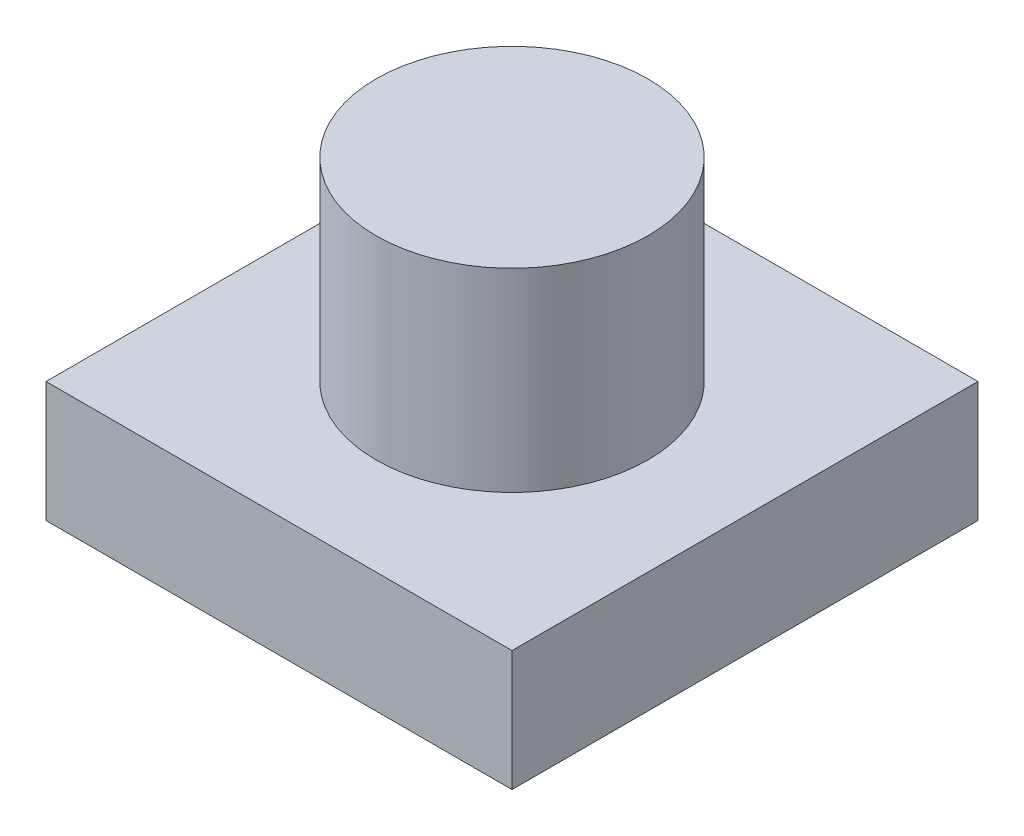
ISO-10303-21;
HEADER;
FILE_DESCRIPTION(('STEP AP214'),'2;1');
FILE_NAME('part.step','',(''),(''),'','','');
FILE_SCHEMA(('AUTOMOTIVE_DESIGN { 1 0 10303 214 1 1 1 1 }'));
ENDSEC;
DATA;
#1=APPLICATION_CONTEXT('core data for automotive mechanical design processes');
#2=APPLICATION_PROTOCOL_DEFINITION('international standard','automotive_design',2000,#1);
#3=PRODUCT_CONTEXT('',#1,'mechanical');
#4=PRODUCT('Part','Part','',(#3));
#5=PRODUCT_RELATED_PRODUCT_CATEGORY('part','',(#4));
#6=PRODUCT_DEFINITION_FORMATION('','',#4);
#7=PRODUCT_DEFINITION_CONTEXT('part definition',#1,'design');
#8=PRODUCT_DEFINITION('design','',#6,#7);
#9=PRODUCT_DEFINITION_SHAPE('','',#8);
#10=(LENGTH_UNIT() NAMED_UNIT(*) SI_UNIT(.MILLI.,.METRE.));
#11=(NAMED_UNIT(*) PLANE_ANGLE_UNIT() SI_UNIT($,.RADIAN.));
#12=(NAMED_UNIT(*) SI_UNIT($,.STERADIAN.) SOLID_ANGLE_UNIT());
#13=UNCERTAINTY_MEASURE_WITH_UNIT(LENGTH_MEASURE(1.E-05),#10,'distance_accuracy_value','');
#14=(GEOMETRIC_REPRESENTATION_CONTEXT(3) GLOBAL_UNCERTAINTY_ASSIGNED_CONTEXT((#13)) GLOBAL_UNIT_ASSIGNED_CONTEXT((#10,
#11,#12)) REPRESENTATION_CONTEXT('',''));
#15=CARTESIAN_POINT('',(0.,0.,0.));
#16=DIRECTION('',(0.,0.,1.));
#17=DIRECTION('',(1.,0.,0.));
#18=AXIS2_PLACEMENT_3D('',#15,#16,#17);
#19=CARTESIAN_POINT('',(-6.,3.1,-6.));
#20=DIRECTION('',(0.,1.,0.));
#21=DIRECTION('',(0.,0.,1.));
#22=AXIS2_PLACEMENT_3D('',#19,#20,#21);
#23=PLANE('',#22);
#24=DIRECTION('',(0.,0.,1.));
#25=VECTOR('',#24,1.);
#26=CARTESIAN_POINT('',(-6.,3.1,-6.));
#27=LINE('',#26,#25);
#28=CARTESIAN_POINT('',(-6.,3.1,-6.));
#29=VERTEX_POINT('',#28);
#30=CARTESIAN_POINT('',(-6.,3.1,6.));
#31=VERTEX_POINT('',#30);
#32=EDGE_CURVE('E101',#29,#31,#27,.T.);
#33=ORIENTED_EDGE('',*,*,#32,.T.);
#34=DIRECTION('',(1.,0.,0.));
#35=VECTOR('',#34,1.);
#36=CARTESIAN_POINT('',(-6.,3.1,6.));
#37=LINE('',#36,#35);
#38=CARTESIAN_POINT('',(6.00000000000003,3.1,6.));
#39=VERTEX_POINT('',#38);
#40=EDGE_CURVE('E86',#31,#39,#37,.T.);
#41=ORIENTED_EDGE('',*,*,#40,.T.);
#42=DIRECTION('',(0.,0.,-1.));
#43=VECTOR('',#42,1.);
#44=CARTESIAN_POINT('',(6.,3.1,-6.));
#45=LINE('',#44,#43);
#46=CARTESIAN_POINT('',(6.,3.1,-6.));
#47=VERTEX_POINT('',#46);
#48=EDGE_CURVE('E53',#39,#47,#45,.T.);
#49=ORIENTED_EDGE('',*,*,#48,.T.);
#50=DIRECTION('',(-1.,0.,0.));
#51=VECTOR('',#50,1.);
#52=CARTESIAN_POINT('',(-6.,3.1,-6.));
#53=LINE('',#52,#51);
#54=EDGE_CURVE('E48',#47,#29,#53,.T.);
#55=ORIENTED_EDGE('',*,*,#54,.T.);
#56=EDGE_LOOP('',(#33,#41,#49,#55));
#57=FACE_BOUND('',#56,.T.);
#58=CARTESIAN_POINT('',(0.,3.1,0.));
#59=DIRECTION('',(0.,1.,0.));
#60=DIRECTION('',(0.,0.,1.));
#61=AXIS2_PLACEMENT_3D('',#58,#59,#60);
#62=CIRCLE('',#61,3.5);
#63=CARTESIAN_POINT('',(0.,3.1,3.5));
#64=VERTEX_POINT('',#63);
#65=EDGE_CURVE('E94',#64,#64,#62,.T.);
#66=ORIENTED_EDGE('',*,*,#65,.F.);
#67=EDGE_LOOP('',(#66));
#68=FACE_BOUND('',#67,.T.);
#69=ADVANCED_FACE('F33',(#57,#68),#23,.T.);
#70=CARTESIAN_POINT('',(-6.,3.1,-6.));
#71=DIRECTION('',(1.,0.,0.));
#72=DIRECTION('',(0.,0.,-1.));
#73=AXIS2_PLACEMENT_3D('',#70,#71,#72);
#74=PLANE('',#73);
#75=DIRECTION('',(0.,0.,1.));
#76=VECTOR('',#75,1.);
#77=CARTESIAN_POINT('',(-6.,0.,-6.));
#78=LINE('',#77,#76);
#79=CARTESIAN_POINT('',(-6.,0.,-6.));
#80=VERTEX_POINT('',#79);
#81=CARTESIAN_POINT('',(-6.,0.,6.));
#82=VERTEX_POINT('',#81);
#83=EDGE_CURVE('E78',#80,#82,#78,.T.);
#84=ORIENTED_EDGE('',*,*,#83,.T.);
#85=DIRECTION('',(0.,-1.,0.));
#86=VECTOR('',#85,1.);
#87=CARTESIAN_POINT('',(-6.,3.1,6.));
#88=LINE('',#87,#86);
#89=EDGE_CURVE('E11',#31,#82,#88,.T.);
#90=ORIENTED_EDGE('',*,*,#89,.F.);
#91=ORIENTED_EDGE('',*,*,#32,.F.);
#92=DIRECTION('',(0.,-1.,0.));
#93=VECTOR('',#92,1.);
#94=CARTESIAN_POINT('',(-6.,3.1,-6.));
#95=LINE('',#94,#93);
#96=EDGE_CURVE('E90',#29,#80,#95,.T.);
#97=ORIENTED_EDGE('',*,*,#96,.T.);
#98=EDGE_LOOP('',(#84,#90,#91,#97));
#99=FACE_BOUND('',#98,.T.);
#100=ADVANCED_FACE('F35',(#99),#74,.F.);
#101=CARTESIAN_POINT('',(-6.,3.1,6.));
#102=DIRECTION('',(0.,0.,-1.));
#103=DIRECTION('',(-1.,0.,0.));
#104=AXIS2_PLACEMENT_3D('',#101,#102,#103);
#105=PLANE('',#104);
#106=DIRECTION('',(1.,0.,0.));
#107=VECTOR('',#106,1.);
#108=CARTESIAN_POINT('',(-6.,0.,6.));
#109=LINE('',#108,#107);
#110=CARTESIAN_POINT('',(6.00000000000003,0.,6.));
#111=VERTEX_POINT('',#110);
#112=EDGE_CURVE('E74',#82,#111,#109,.T.);
#113=ORIENTED_EDGE('',*,*,#112,.T.);
#114=DIRECTION('',(0.,-1.,0.));
#115=VECTOR('',#114,1.);
#116=CARTESIAN_POINT('',(6.00000000000003,3.1,6.));
#117=LINE('',#116,#115);
#118=EDGE_CURVE('E41',#39,#111,#117,.T.);
#119=ORIENTED_EDGE('',*,*,#118,.F.);
#120=ORIENTED_EDGE('',*,*,#40,.F.);
#121=ORIENTED_EDGE('',*,*,#89,.T.);
#122=EDGE_LOOP('',(#113,#119,#120,#121));
#123=FACE_BOUND('',#122,.T.);
#124=ADVANCED_FACE('F85',(#123),#105,.F.);
#125=CARTESIAN_POINT('',(6.,3.1,-6.));
#126=DIRECTION('',(-1.,0.,0.));
#127=DIRECTION('',(0.,0.,1.));
#128=AXIS2_PLACEMENT_3D('',#125,#126,#127);
#129=PLANE('',#128);
#130=DIRECTION('',(0.,0.,-1.));
#131=VECTOR('',#130,1.);
#132=CARTESIAN_POINT('',(6.,0.,-6.));
#133=LINE('',#132,#131);
#134=CARTESIAN_POINT('',(6.,0.,-6.));
#135=VERTEX_POINT('',#134);
#136=EDGE_CURVE('E79',#111,#135,#133,.T.);
#137=ORIENTED_EDGE('',*,*,#136,.T.);
#138=DIRECTION('',(0.,-1.,0.));
#139=VECTOR('',#138,1.);
#140=CARTESIAN_POINT('',(6.,3.1,-6.));
#141=LINE('',#140,#139);
#142=EDGE_CURVE('E107',#47,#135,#141,.T.);
#143=ORIENTED_EDGE('',*,*,#142,.F.);
#144=ORIENTED_EDGE('',*,*,#48,.F.);
#145=ORIENTED_EDGE('',*,*,#118,.T.);
#146=EDGE_LOOP('',(#137,#143,#144,#145));
#147=FACE_BOUND('',#146,.T.);
#148=ADVANCED_FACE('F110',(#147),#129,.F.);
#149=CARTESIAN_POINT('',(-6.,3.1,-6.));
#150=DIRECTION('',(0.,0.,1.));
#151=DIRECTION('',(1.,0.,0.));
#152=AXIS2_PLACEMENT_3D('',#149,#150,#151);
#153=PLANE('',#152);
#154=DIRECTION('',(-1.,0.,0.));
#155=VECTOR('',#154,1.);
#156=CARTESIAN_POINT('',(-6.,0.,-6.));
#157=LINE('',#156,#155);
#158=EDGE_CURVE('E99',#135,#80,#157,.T.);
#159=ORIENTED_EDGE('',*,*,#158,.T.);
#160=ORIENTED_EDGE('',*,*,#96,.F.);
#161=ORIENTED_EDGE('',*,*,#54,.F.);
#162=ORIENTED_EDGE('',*,*,#142,.T.);
#163=EDGE_LOOP('',(#159,#160,#161,#162));
#164=FACE_BOUND('',#163,.T.);
#165=ADVANCED_FACE('F112',(#164),#153,.F.);
#166=CARTESIAN_POINT('',(-6.,0.,-6.));
#167=DIRECTION('',(0.,1.,0.));
#168=DIRECTION('',(0.,0.,1.));
#169=AXIS2_PLACEMENT_3D('',#166,#167,#168);
#170=PLANE('',#169);
#171=ORIENTED_EDGE('',*,*,#83,.F.);
#172=ORIENTED_EDGE('',*,*,#158,.F.);
#173=ORIENTED_EDGE('',*,*,#136,.F.);
#174=ORIENTED_EDGE('',*,*,#112,.F.);
#175=EDGE_LOOP('',(#171,#172,#173,#174));
#176=FACE_BOUND('',#175,.T.);
#177=ADVANCED_FACE('F75',(#176),#170,.F.);
#178=CARTESIAN_POINT('',(0.,8.1,0.));
#179=DIRECTION('',(0.,-1.,0.));
#180=DIRECTION('',(0.,0.,-1.));
#181=AXIS2_PLACEMENT_3D('',#178,#179,#180);
#182=CYLINDRICAL_SURFACE('',#181,3.5);
#183=CARTESIAN_POINT('',(0.,8.1,0.));
#184=DIRECTION('',(0.,1.,0.));
#185=DIRECTION('',(0.,0.,1.));
#186=AXIS2_PLACEMENT_3D('',#183,#184,#185);
#187=CIRCLE('',#186,3.5);
#188=CARTESIAN_POINT('',(0.,8.1,3.5));
#189=VERTEX_POINT('',#188);
#190=EDGE_CURVE('E91',#189,#189,#187,.T.);
#191=ORIENTED_EDGE('',*,*,#190,.F.);
#192=EDGE_LOOP('',(#191));
#193=FACE_BOUND('',#192,.T.);
#194=ORIENTED_EDGE('',*,*,#65,.T.);
#195=EDGE_LOOP('',(#194));
#196=FACE_BOUND('',#195,.T.);
#197=ADVANCED_FACE('F119',(#193,#196),#182,.T.);
#198=CARTESIAN_POINT('',(0.,8.1,0.));
#199=DIRECTION('',(0.,1.,0.));
#200=DIRECTION('',(0.,0.,1.));
#201=AXIS2_PLACEMENT_3D('',#198,#199,#200);
#202=PLANE('',#201);
#203=ORIENTED_EDGE('',*,*,#190,.T.);
#204=EDGE_LOOP('',(#203));
#205=FACE_BOUND('',#204,.T.);
#206=ADVANCED_FACE('F121',(#205),#202,.T.);
#207=CLOSED_SHELL('',(#69,#100,#124,#148,#165,#177,#197,#206));
#208=MANIFOLD_SOLID_BREP('B2',#207);
#209=ADVANCED_BREP_SHAPE_REPRESENTATION('',(#18,#208),#14);
#210=SHAPE_DEFINITION_REPRESENTATION(#9,#209);
ENDSEC;
END-ISO-10303-21;
